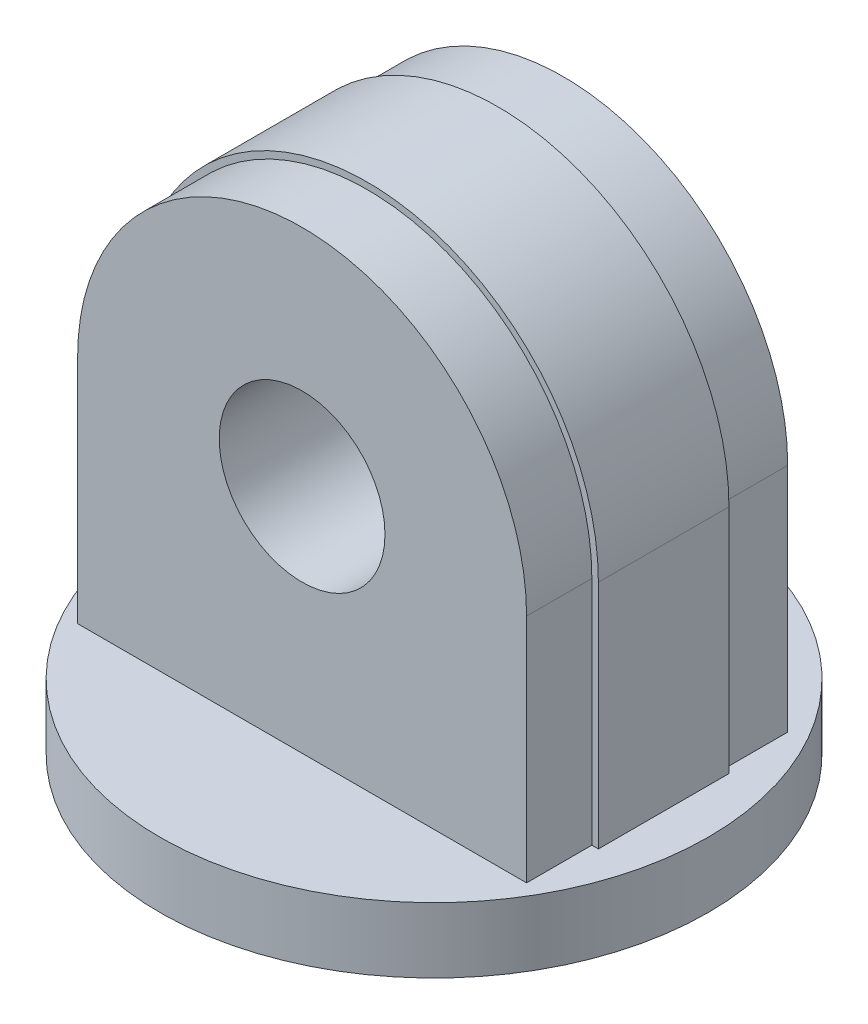
ISO-10303-21;
HEADER;
FILE_DESCRIPTION(('STEP AP214'),'2;1');
FILE_NAME('part.step','',(''),(''),'','','');
FILE_SCHEMA(('AUTOMOTIVE_DESIGN { 1 0 10303 214 1 1 1 1 }'));
ENDSEC;
DATA;
#1=APPLICATION_CONTEXT('core data for automotive mechanical design processes');
#2=APPLICATION_PROTOCOL_DEFINITION('international standard','automotive_design',2000,#1);
#3=PRODUCT_CONTEXT('',#1,'mechanical');
#4=PRODUCT('Part','Part','',(#3));
#5=PRODUCT_RELATED_PRODUCT_CATEGORY('part','',(#4));
#6=PRODUCT_DEFINITION_FORMATION('','',#4);
#7=PRODUCT_DEFINITION_CONTEXT('part definition',#1,'design');
#8=PRODUCT_DEFINITION('design','',#6,#7);
#9=PRODUCT_DEFINITION_SHAPE('','',#8);
#10=(LENGTH_UNIT() NAMED_UNIT(*) SI_UNIT(.MILLI.,.METRE.));
#11=(NAMED_UNIT(*) PLANE_ANGLE_UNIT() SI_UNIT($,.RADIAN.));
#12=(NAMED_UNIT(*) SI_UNIT($,.STERADIAN.) SOLID_ANGLE_UNIT());
#13=UNCERTAINTY_MEASURE_WITH_UNIT(LENGTH_MEASURE(1.E-05),#10,'distance_accuracy_value','');
#14=(GEOMETRIC_REPRESENTATION_CONTEXT(3) GLOBAL_UNCERTAINTY_ASSIGNED_CONTEXT((#13)) GLOBAL_UNIT_ASSIGNED_CONTEXT((#10,
#11,#12)) REPRESENTATION_CONTEXT('',''));
#15=CARTESIAN_POINT('',(0.,0.,0.));
#16=DIRECTION('',(0.,0.,1.));
#17=DIRECTION('',(1.,0.,0.));
#18=AXIS2_PLACEMENT_3D('',#15,#16,#17);
#19=CARTESIAN_POINT('',(8.9888749682031,-0.708464433330711,5.08));
#20=DIRECTION('',(0.,0.,-1.));
#21=DIRECTION('',(-1.,0.,0.));
#22=AXIS2_PLACEMENT_3D('',#19,#20,#21);
#23=CYLINDRICAL_SURFACE('',#22,8.98887496820316);
#24=CARTESIAN_POINT('',(8.9888749682031,-0.708464433330711,-2.54));
#25=DIRECTION('',(0.,0.,1.));
#26=DIRECTION('',(1.,0.,0.));
#27=AXIS2_PLACEMENT_3D('',#24,#25,#26);
#28=CIRCLE('',#27,8.98887496820316);
#29=CARTESIAN_POINT('',(17.9777499364063,-0.708464433330711,-2.54));
#30=VERTEX_POINT('',#29);
#31=CARTESIAN_POINT('',(0.,-0.708464433330711,-2.54));
#32=VERTEX_POINT('',#31);
#33=EDGE_CURVE('E190',#30,#32,#28,.T.);
#34=ORIENTED_EDGE('',*,*,#33,.T.);
#35=DIRECTION('',(0.,0.,-1.));
#36=VECTOR('',#35,1.);
#37=CARTESIAN_POINT('',(0.,-0.708464433330711,5.08));
#38=LINE('',#37,#36);
#39=CARTESIAN_POINT('',(0.,-0.708464433330711,2.54));
#40=VERTEX_POINT('',#39);
#41=EDGE_CURVE('E11',#40,#32,#38,.T.);
#42=ORIENTED_EDGE('',*,*,#41,.F.);
#43=CARTESIAN_POINT('',(8.9888749682031,-0.708464433330711,2.54));
#44=DIRECTION('',(0.,0.,1.));
#45=DIRECTION('',(1.,0.,0.));
#46=AXIS2_PLACEMENT_3D('',#43,#44,#45);
#47=CIRCLE('',#46,8.98887496820316);
#48=CARTESIAN_POINT('',(17.9777499364063,-0.708464433330711,2.54));
#49=VERTEX_POINT('',#48);
#50=EDGE_CURVE('E79',#49,#40,#47,.T.);
#51=ORIENTED_EDGE('',*,*,#50,.F.);
#52=DIRECTION('',(0.,0.,-1.));
#53=VECTOR('',#52,1.);
#54=CARTESIAN_POINT('',(17.9777499364063,-0.708464433330711,5.08));
#55=LINE('',#54,#53);
#56=EDGE_CURVE('E144',#49,#30,#55,.T.);
#57=ORIENTED_EDGE('',*,*,#56,.T.);
#58=EDGE_LOOP('',(#34,#42,#51,#57));
#59=FACE_BOUND('',#58,.T.);
#60=ADVANCED_FACE('F32',(#59),#23,.T.);
#61=CARTESIAN_POINT('',(0.,-9.69733940153393,5.08));
#62=DIRECTION('',(1.,0.,0.));
#63=DIRECTION('',(0.,0.,-1.));
#64=AXIS2_PLACEMENT_3D('',#61,#62,#63);
#65=PLANE('',#64);
#66=DIRECTION('',(0.,-1.,0.));
#67=VECTOR('',#66,1.);
#68=CARTESIAN_POINT('',(0.,-0.708464433330711,-2.54));
#69=LINE('',#68,#67);
#70=CARTESIAN_POINT('',(0.,-9.69733940153393,-2.54));
#71=VERTEX_POINT('',#70);
#72=EDGE_CURVE('E168',#32,#71,#69,.T.);
#73=ORIENTED_EDGE('',*,*,#72,.T.);
#74=DIRECTION('',(0.,0.,-1.));
#75=VECTOR('',#74,1.);
#76=CARTESIAN_POINT('',(0.,-9.69733940153393,5.08));
#77=LINE('',#76,#75);
#78=CARTESIAN_POINT('',(0.,-9.69733940153393,2.54));
#79=VERTEX_POINT('',#78);
#80=EDGE_CURVE('E41',#79,#71,#77,.T.);
#81=ORIENTED_EDGE('',*,*,#80,.F.);
#82=DIRECTION('',(0.,-1.,0.));
#83=VECTOR('',#82,1.);
#84=CARTESIAN_POINT('',(0.,-0.708464433330711,2.54));
#85=LINE('',#84,#83);
#86=EDGE_CURVE('E165',#40,#79,#85,.T.);
#87=ORIENTED_EDGE('',*,*,#86,.F.);
#88=ORIENTED_EDGE('',*,*,#41,.T.);
#89=EDGE_LOOP('',(#73,#81,#87,#88));
#90=FACE_BOUND('',#89,.T.);
#91=ADVANCED_FACE('F164',(#90),#65,.F.);
#92=CARTESIAN_POINT('',(17.9777499364063,-0.708464433330711,5.08));
#93=DIRECTION('',(-1.,0.,0.));
#94=DIRECTION('',(0.,-1.,0.));
#95=AXIS2_PLACEMENT_3D('',#92,#93,#94);
#96=PLANE('',#95);
#97=DIRECTION('',(0.,1.,0.));
#98=VECTOR('',#97,1.);
#99=CARTESIAN_POINT('',(17.9777499364063,-9.69733940153393,-2.54));
#100=LINE('',#99,#98);
#101=CARTESIAN_POINT('',(17.9777499364063,-9.69733940153393,-2.54));
#102=VERTEX_POINT('',#101);
#103=EDGE_CURVE('E233',#102,#30,#100,.T.);
#104=ORIENTED_EDGE('',*,*,#103,.T.);
#105=ORIENTED_EDGE('',*,*,#56,.F.);
#106=DIRECTION('',(0.,1.,0.));
#107=VECTOR('',#106,1.);
#108=CARTESIAN_POINT('',(17.9777499364063,-9.69733940153393,2.54));
#109=LINE('',#108,#107);
#110=CARTESIAN_POINT('',(17.9777499364063,-9.69733940153393,2.54));
#111=VERTEX_POINT('',#110);
#112=EDGE_CURVE('E49',#111,#49,#109,.T.);
#113=ORIENTED_EDGE('',*,*,#112,.F.);
#114=DIRECTION('',(0.,0.,-1.));
#115=VECTOR('',#114,1.);
#116=CARTESIAN_POINT('',(17.9777499364063,-9.69733940153393,5.08));
#117=LINE('',#116,#115);
#118=EDGE_CURVE('E109',#111,#102,#117,.T.);
#119=ORIENTED_EDGE('',*,*,#118,.T.);
#120=EDGE_LOOP('',(#104,#105,#113,#119));
#121=FACE_BOUND('',#120,.T.);
#122=ADVANCED_FACE('F218',(#121),#96,.F.);
#123=CARTESIAN_POINT('',(8.9888749682031,-0.708464433330711,-5.08));
#124=DIRECTION('',(0.,0.,-1.));
#125=DIRECTION('',(-1.,0.,0.));
#126=AXIS2_PLACEMENT_3D('',#123,#124,#125);
#127=PLANE('',#126);
#128=CARTESIAN_POINT('',(8.9888749682031,-0.708464433330711,-5.08));
#129=DIRECTION('',(0.,0.,-1.));
#130=DIRECTION('',(-1.,0.,0.));
#131=AXIS2_PLACEMENT_3D('',#128,#129,#130);
#132=CIRCLE('',#131,3.22500000000027);
#133=CARTESIAN_POINT('',(5.76387496820282,-0.708464433330711,-5.08));
#134=VERTEX_POINT('',#133);
#135=EDGE_CURVE('E35',#134,#134,#132,.T.);
#136=ORIENTED_EDGE('',*,*,#135,.F.);
#137=EDGE_LOOP('',(#136));
#138=FACE_BOUND('',#137,.T.);
#139=DIRECTION('',(1.,0.,0.));
#140=VECTOR('',#139,1.);
#141=CARTESIAN_POINT('',(17.9777499364063,-9.69733940153393,-5.08));
#142=LINE('',#141,#140);
#143=CARTESIAN_POINT('',(0.254,-9.69733940153393,-5.08));
#144=VERTEX_POINT('',#143);
#145=CARTESIAN_POINT('',(17.7237499364063,-9.69733940153393,-5.08));
#146=VERTEX_POINT('',#145);
#147=EDGE_CURVE('E138',#144,#146,#142,.T.);
#148=ORIENTED_EDGE('',*,*,#147,.F.);
#149=DIRECTION('',(0.,1.,0.));
#150=VECTOR('',#149,1.);
#151=CARTESIAN_POINT('',(0.254,-0.708464433330711,-5.08));
#152=LINE('',#151,#150);
#153=CARTESIAN_POINT('',(0.254,-0.708464433330711,-5.08));
#154=VERTEX_POINT('',#153);
#155=EDGE_CURVE('E187',#144,#154,#152,.T.);
#156=ORIENTED_EDGE('',*,*,#155,.T.);
#157=CARTESIAN_POINT('',(8.9888749682031,-0.708464433330711,-5.08));
#158=DIRECTION('',(0.,0.,-1.));
#159=DIRECTION('',(1.,0.,0.));
#160=AXIS2_PLACEMENT_3D('',#157,#158,#159);
#161=CIRCLE('',#160,8.73487496820313);
#162=CARTESIAN_POINT('',(17.7237499364062,-0.708464433330711,-5.08));
#163=VERTEX_POINT('',#162);
#164=EDGE_CURVE('E184',#154,#163,#161,.T.);
#165=ORIENTED_EDGE('',*,*,#164,.T.);
#166=DIRECTION('',(0.,-1.,0.));
#167=VECTOR('',#166,1.);
#168=CARTESIAN_POINT('',(17.7237499364063,-9.69733940153393,-5.08));
#169=LINE('',#168,#167);
#170=EDGE_CURVE('E181',#163,#146,#169,.T.);
#171=ORIENTED_EDGE('',*,*,#170,.T.);
#172=EDGE_LOOP('',(#148,#156,#165,#171));
#173=FACE_BOUND('',#172,.T.);
#174=ADVANCED_FACE('F209',(#138,#173),#127,.T.);
#175=CARTESIAN_POINT('',(8.9888749682031,-0.708464433330711,5.08));
#176=DIRECTION('',(0.,0.,-1.));
#177=DIRECTION('',(-1.,0.,0.));
#178=AXIS2_PLACEMENT_3D('',#175,#176,#177);
#179=PLANE('',#178);
#180=CARTESIAN_POINT('',(8.9888749682031,-0.708464433330711,5.08));
#181=DIRECTION('',(0.,0.,1.));
#182=DIRECTION('',(1.,0.,0.));
#183=AXIS2_PLACEMENT_3D('',#180,#181,#182);
#184=CIRCLE('',#183,3.22500000000027);
#185=CARTESIAN_POINT('',(12.2138749682034,-0.708464433330711,5.08));
#186=VERTEX_POINT('',#185);
#187=EDGE_CURVE('E101',#186,#186,#184,.T.);
#188=ORIENTED_EDGE('',*,*,#187,.F.);
#189=EDGE_LOOP('',(#188));
#190=FACE_BOUND('',#189,.T.);
#191=DIRECTION('',(1.,0.,0.));
#192=VECTOR('',#191,1.);
#193=CARTESIAN_POINT('',(17.9777499364063,-9.69733940153393,5.08));
#194=LINE('',#193,#192);
#195=CARTESIAN_POINT('',(0.254,-9.69733940153393,5.08));
#196=VERTEX_POINT('',#195);
#197=CARTESIAN_POINT('',(17.7237499364063,-9.69733940153393,5.08));
#198=VERTEX_POINT('',#197);
#199=EDGE_CURVE('E142',#196,#198,#194,.T.);
#200=ORIENTED_EDGE('',*,*,#199,.T.);
#201=DIRECTION('',(0.,-1.,0.));
#202=VECTOR('',#201,1.);
#203=CARTESIAN_POINT('',(17.7237499364063,-9.69733940153393,5.08));
#204=LINE('',#203,#202);
#205=CARTESIAN_POINT('',(17.7237499364062,-0.708464433330711,5.08));
#206=VERTEX_POINT('',#205);
#207=EDGE_CURVE('E99',#206,#198,#204,.T.);
#208=ORIENTED_EDGE('',*,*,#207,.F.);
#209=CARTESIAN_POINT('',(8.9888749682031,-0.708464433330711,5.08));
#210=DIRECTION('',(0.,0.,-1.));
#211=DIRECTION('',(1.,0.,0.));
#212=AXIS2_PLACEMENT_3D('',#209,#210,#211);
#213=CIRCLE('',#212,8.73487496820313);
#214=CARTESIAN_POINT('',(0.254,-0.708464433330711,5.08));
#215=VERTEX_POINT('',#214);
#216=EDGE_CURVE('E125',#215,#206,#213,.T.);
#217=ORIENTED_EDGE('',*,*,#216,.F.);
#218=DIRECTION('',(0.,1.,0.));
#219=VECTOR('',#218,1.);
#220=CARTESIAN_POINT('',(0.254,-0.708464433330711,5.08));
#221=LINE('',#220,#219);
#222=EDGE_CURVE('E122',#196,#215,#221,.T.);
#223=ORIENTED_EDGE('',*,*,#222,.F.);
#224=EDGE_LOOP('',(#200,#208,#217,#223));
#225=FACE_BOUND('',#224,.T.);
#226=ADVANCED_FACE('F207',(#190,#225),#179,.F.);
#227=CARTESIAN_POINT('',(9.0435857327458,-9.69733940153393,0.));
#228=DIRECTION('',(0.,-1.,0.));
#229=DIRECTION('',(1.,0.,0.));
#230=AXIS2_PLACEMENT_3D('',#227,#228,#229);
#231=PLANE('',#230);
#232=ORIENTED_EDGE('',*,*,#118,.F.);
#233=DIRECTION('',(1.,0.,0.));
#234=VECTOR('',#233,1.);
#235=CARTESIAN_POINT('',(17.7237499364063,-9.69733940153393,2.54));
#236=LINE('',#235,#234);
#237=CARTESIAN_POINT('',(17.7237499364063,-9.69733940153393,2.54));
#238=VERTEX_POINT('',#237);
#239=EDGE_CURVE('E104',#238,#111,#236,.T.);
#240=ORIENTED_EDGE('',*,*,#239,.F.);
#241=DIRECTION('',(0.,0.,1.));
#242=VECTOR('',#241,1.);
#243=CARTESIAN_POINT('',(17.7237499364063,-9.69733940153393,2.54));
#244=LINE('',#243,#242);
#245=EDGE_CURVE('E75',#238,#198,#244,.T.);
#246=ORIENTED_EDGE('',*,*,#245,.T.);
#247=ORIENTED_EDGE('',*,*,#199,.F.);
#248=DIRECTION('',(0.,0.,1.));
#249=VECTOR('',#248,1.);
#250=CARTESIAN_POINT('',(0.254,-9.69733940153393,2.54));
#251=LINE('',#250,#249);
#252=CARTESIAN_POINT('',(0.254,-9.69733940153393,2.54));
#253=VERTEX_POINT('',#252);
#254=EDGE_CURVE('E121',#253,#196,#251,.T.);
#255=ORIENTED_EDGE('',*,*,#254,.F.);
#256=DIRECTION('',(1.,0.,0.));
#257=VECTOR('',#256,1.);
#258=CARTESIAN_POINT('',(0.254,-9.69733940153393,2.54));
#259=LINE('',#258,#257);
#260=EDGE_CURVE('E160',#79,#253,#259,.T.);
#261=ORIENTED_EDGE('',*,*,#260,.F.);
#262=ORIENTED_EDGE('',*,*,#80,.T.);
#263=DIRECTION('',(1.,0.,0.));
#264=VECTOR('',#263,1.);
#265=CARTESIAN_POINT('',(0.254,-9.69733940153393,-2.54));
#266=LINE('',#265,#264);
#267=CARTESIAN_POINT('',(0.254,-9.69733940153393,-2.54));
#268=VERTEX_POINT('',#267);
#269=EDGE_CURVE('E157',#71,#268,#266,.T.);
#270=ORIENTED_EDGE('',*,*,#269,.T.);
#271=DIRECTION('',(0.,0.,-1.));
#272=VECTOR('',#271,1.);
#273=CARTESIAN_POINT('',(0.254,-9.69733940153393,-2.54));
#274=LINE('',#273,#272);
#275=EDGE_CURVE('E126',#268,#144,#274,.T.);
#276=ORIENTED_EDGE('',*,*,#275,.T.);
#277=ORIENTED_EDGE('',*,*,#147,.T.);
#278=DIRECTION('',(0.,0.,-1.));
#279=VECTOR('',#278,1.);
#280=CARTESIAN_POINT('',(17.7237499364063,-9.69733940153393,-2.54));
#281=LINE('',#280,#279);
#282=CARTESIAN_POINT('',(17.7237499364063,-9.69733940153393,-2.54));
#283=VERTEX_POINT('',#282);
#284=EDGE_CURVE('E172',#283,#146,#281,.T.);
#285=ORIENTED_EDGE('',*,*,#284,.F.);
#286=DIRECTION('',(1.,0.,0.));
#287=VECTOR('',#286,1.);
#288=CARTESIAN_POINT('',(17.7237499364063,-9.69733940153393,-2.54));
#289=LINE('',#288,#287);
#290=EDGE_CURVE('E235',#283,#102,#289,.T.);
#291=ORIENTED_EDGE('',*,*,#290,.T.);
#292=EDGE_LOOP('',(#232,#240,#246,#247,#255,#261,#262,#270,#276,#277,#285,#291));
#293=FACE_BOUND('',#292,.T.);
#294=CARTESIAN_POINT('',(9.0435857327458,-9.69733940153393,0.));
#295=DIRECTION('',(0.,-1.,0.));
#296=DIRECTION('',(1.,0.,0.));
#297=AXIS2_PLACEMENT_3D('',#294,#295,#296);
#298=CIRCLE('',#297,10.6746275824842);
#299=CARTESIAN_POINT('',(19.71821331523,-9.69733940153393,0.));
#300=VERTEX_POINT('',#299);
#301=EDGE_CURVE('E139',#300,#300,#298,.T.);
#302=ORIENTED_EDGE('',*,*,#301,.F.);
#303=EDGE_LOOP('',(#302));
#304=FACE_BOUND('',#303,.T.);
#305=ADVANCED_FACE('F105',(#293,#304),#231,.F.);
#306=CARTESIAN_POINT('',(9.0435857327458,-12.2373394015339,0.));
#307=DIRECTION('',(0.,1.,0.));
#308=DIRECTION('',(-1.,0.,0.));
#309=AXIS2_PLACEMENT_3D('',#306,#307,#308);
#310=CYLINDRICAL_SURFACE('',#309,10.6746275824842);
#311=CARTESIAN_POINT('',(9.0435857327458,-12.2373394015339,0.));
#312=DIRECTION('',(0.,-1.,0.));
#313=DIRECTION('',(1.,0.,0.));
#314=AXIS2_PLACEMENT_3D('',#311,#312,#313);
#315=CIRCLE('',#314,10.6746275824842);
#316=CARTESIAN_POINT('',(19.71821331523,-12.2373394015339,0.));
#317=VERTEX_POINT('',#316);
#318=EDGE_CURVE('E135',#317,#317,#315,.T.);
#319=ORIENTED_EDGE('',*,*,#318,.F.);
#320=EDGE_LOOP('',(#319));
#321=FACE_BOUND('',#320,.T.);
#322=ORIENTED_EDGE('',*,*,#301,.T.);
#323=EDGE_LOOP('',(#322));
#324=FACE_BOUND('',#323,.T.);
#325=ADVANCED_FACE('F216',(#321,#324),#310,.T.);
#326=CARTESIAN_POINT('',(9.0435857327458,-12.2373394015339,0.));
#327=DIRECTION('',(0.,-1.,0.));
#328=DIRECTION('',(1.,0.,0.));
#329=AXIS2_PLACEMENT_3D('',#326,#327,#328);
#330=PLANE('',#329);
#331=ORIENTED_EDGE('',*,*,#318,.T.);
#332=EDGE_LOOP('',(#331));
#333=FACE_BOUND('',#332,.T.);
#334=ADVANCED_FACE('F347',(#333),#330,.T.);
#335=CARTESIAN_POINT('',(8.9888749682031,-0.708464433330711,-10.6746275824842));
#336=DIRECTION('',(0.,0.,1.));
#337=DIRECTION('',(1.,0.,0.));
#338=AXIS2_PLACEMENT_3D('',#335,#336,#337);
#339=CYLINDRICAL_SURFACE('',#338,3.22500000000027);
#340=ORIENTED_EDGE('',*,*,#135,.T.);
#341=EDGE_LOOP('',(#340));
#342=FACE_BOUND('',#341,.T.);
#343=ORIENTED_EDGE('',*,*,#187,.T.);
#344=EDGE_LOOP('',(#343));
#345=FACE_BOUND('',#344,.T.);
#346=ADVANCED_FACE('F340',(#342,#345),#339,.F.);
#347=CARTESIAN_POINT('',(17.7237499364063,-9.69733940153393,2.54));
#348=DIRECTION('',(-1.,0.,0.));
#349=DIRECTION('',(0.,-1.,0.));
#350=AXIS2_PLACEMENT_3D('',#347,#348,#349);
#351=PLANE('',#350);
#352=ORIENTED_EDGE('',*,*,#207,.T.);
#353=ORIENTED_EDGE('',*,*,#245,.F.);
#354=DIRECTION('',(0.,-1.,0.));
#355=VECTOR('',#354,1.);
#356=CARTESIAN_POINT('',(17.7237499364063,-9.69733940153393,2.54));
#357=LINE('',#356,#355);
#358=CARTESIAN_POINT('',(17.7237499364062,-0.708464433330711,2.54));
#359=VERTEX_POINT('',#358);
#360=EDGE_CURVE('E96',#359,#238,#357,.T.);
#361=ORIENTED_EDGE('',*,*,#360,.F.);
#362=DIRECTION('',(0.,0.,1.));
#363=VECTOR('',#362,1.);
#364=CARTESIAN_POINT('',(17.7237499364062,-0.708464433330711,2.54));
#365=LINE('',#364,#363);
#366=EDGE_CURVE('E67',#359,#206,#365,.T.);
#367=ORIENTED_EDGE('',*,*,#366,.T.);
#368=EDGE_LOOP('',(#352,#353,#361,#367));
#369=FACE_BOUND('',#368,.T.);
#370=ADVANCED_FACE('F94',(#369),#351,.F.);
#371=CARTESIAN_POINT('',(8.9888749682031,-0.708464433330711,2.54));
#372=DIRECTION('',(0.,0.,1.));
#373=DIRECTION('',(1.,0.,0.));
#374=AXIS2_PLACEMENT_3D('',#371,#372,#373);
#375=CYLINDRICAL_SURFACE('',#374,8.73487496820313);
#376=ORIENTED_EDGE('',*,*,#216,.T.);
#377=ORIENTED_EDGE('',*,*,#366,.F.);
#378=CARTESIAN_POINT('',(8.9888749682031,-0.708464433330711,2.54));
#379=DIRECTION('',(0.,0.,-1.));
#380=DIRECTION('',(1.,0.,0.));
#381=AXIS2_PLACEMENT_3D('',#378,#379,#380);
#382=CIRCLE('',#381,8.73487496820313);
#383=CARTESIAN_POINT('',(0.254,-0.708464433330711,2.54));
#384=VERTEX_POINT('',#383);
#385=EDGE_CURVE('E114',#384,#359,#382,.T.);
#386=ORIENTED_EDGE('',*,*,#385,.F.);
#387=DIRECTION('',(0.,0.,1.));
#388=VECTOR('',#387,1.);
#389=CARTESIAN_POINT('',(0.254,-0.708464433330711,2.54));
#390=LINE('',#389,#388);
#391=EDGE_CURVE('E130',#384,#215,#390,.T.);
#392=ORIENTED_EDGE('',*,*,#391,.T.);
#393=EDGE_LOOP('',(#376,#377,#386,#392));
#394=FACE_BOUND('',#393,.T.);
#395=ADVANCED_FACE('F205',(#394),#375,.T.);
#396=CARTESIAN_POINT('',(0.254,-0.708464433330711,2.54));
#397=DIRECTION('',(1.,0.,0.));
#398=DIRECTION('',(0.,0.,-1.));
#399=AXIS2_PLACEMENT_3D('',#396,#397,#398);
#400=PLANE('',#399);
#401=ORIENTED_EDGE('',*,*,#222,.T.);
#402=ORIENTED_EDGE('',*,*,#391,.F.);
#403=DIRECTION('',(0.,1.,0.));
#404=VECTOR('',#403,1.);
#405=CARTESIAN_POINT('',(0.254,-0.708464433330711,2.54));
#406=LINE('',#405,#404);
#407=EDGE_CURVE('E116',#253,#384,#406,.T.);
#408=ORIENTED_EDGE('',*,*,#407,.F.);
#409=ORIENTED_EDGE('',*,*,#254,.T.);
#410=EDGE_LOOP('',(#401,#402,#408,#409));
#411=FACE_BOUND('',#410,.T.);
#412=ADVANCED_FACE('F201',(#411),#400,.F.);
#413=CARTESIAN_POINT('',(8.9888749682031,-0.708464433330711,2.54));
#414=DIRECTION('',(0.,0.,1.));
#415=DIRECTION('',(1.,0.,0.));
#416=AXIS2_PLACEMENT_3D('',#413,#414,#415);
#417=PLANE('',#416);
#418=ORIENTED_EDGE('',*,*,#50,.T.);
#419=ORIENTED_EDGE('',*,*,#86,.T.);
#420=ORIENTED_EDGE('',*,*,#260,.T.);
#421=ORIENTED_EDGE('',*,*,#407,.T.);
#422=ORIENTED_EDGE('',*,*,#385,.T.);
#423=ORIENTED_EDGE('',*,*,#360,.T.);
#424=ORIENTED_EDGE('',*,*,#239,.T.);
#425=ORIENTED_EDGE('',*,*,#112,.T.);
#426=EDGE_LOOP('',(#418,#419,#420,#421,#422,#423,#424,#425));
#427=FACE_BOUND('',#426,.T.);
#428=ADVANCED_FACE('F111',(#427),#417,.T.);
#429=CARTESIAN_POINT('',(0.254,-0.708464433330711,-2.54));
#430=DIRECTION('',(-1.,0.,0.));
#431=DIRECTION('',(0.,0.,1.));
#432=AXIS2_PLACEMENT_3D('',#429,#430,#431);
#433=PLANE('',#432);
#434=ORIENTED_EDGE('',*,*,#155,.F.);
#435=ORIENTED_EDGE('',*,*,#275,.F.);
#436=DIRECTION('',(0.,1.,0.));
#437=VECTOR('',#436,1.);
#438=CARTESIAN_POINT('',(0.254,-0.708464433330711,-2.54));
#439=LINE('',#438,#437);
#440=CARTESIAN_POINT('',(0.254,-0.708464433330711,-2.54));
#441=VERTEX_POINT('',#440);
#442=EDGE_CURVE('E177',#268,#441,#439,.T.);
#443=ORIENTED_EDGE('',*,*,#442,.T.);
#444=DIRECTION('',(0.,0.,-1.));
#445=VECTOR('',#444,1.);
#446=CARTESIAN_POINT('',(0.254,-0.708464433330711,-2.54));
#447=LINE('',#446,#445);
#448=EDGE_CURVE('E192',#441,#154,#447,.T.);
#449=ORIENTED_EDGE('',*,*,#448,.T.);
#450=EDGE_LOOP('',(#434,#435,#443,#449));
#451=FACE_BOUND('',#450,.T.);
#452=ADVANCED_FACE('F250',(#451),#433,.T.);
#453=CARTESIAN_POINT('',(8.9888749682031,-0.708464433330711,-2.54));
#454=DIRECTION('',(0.,0.,-1.));
#455=DIRECTION('',(-1.,0.,0.));
#456=AXIS2_PLACEMENT_3D('',#453,#454,#455);
#457=CYLINDRICAL_SURFACE('',#456,8.73487496820313);
#458=ORIENTED_EDGE('',*,*,#164,.F.);
#459=ORIENTED_EDGE('',*,*,#448,.F.);
#460=CARTESIAN_POINT('',(8.9888749682031,-0.708464433330711,-2.54));
#461=DIRECTION('',(0.,0.,-1.));
#462=DIRECTION('',(1.,0.,0.));
#463=AXIS2_PLACEMENT_3D('',#460,#461,#462);
#464=CIRCLE('',#463,8.73487496820313);
#465=CARTESIAN_POINT('',(17.7237499364062,-0.708464433330711,-2.54));
#466=VERTEX_POINT('',#465);
#467=EDGE_CURVE('E242',#441,#466,#464,.T.);
#468=ORIENTED_EDGE('',*,*,#467,.T.);
#469=DIRECTION('',(0.,0.,-1.));
#470=VECTOR('',#469,1.);
#471=CARTESIAN_POINT('',(17.7237499364062,-0.708464433330711,-2.54));
#472=LINE('',#471,#470);
#473=EDGE_CURVE('E175',#466,#163,#472,.T.);
#474=ORIENTED_EDGE('',*,*,#473,.T.);
#475=EDGE_LOOP('',(#458,#459,#468,#474));
#476=FACE_BOUND('',#475,.T.);
#477=ADVANCED_FACE('F257',(#476),#457,.T.);
#478=CARTESIAN_POINT('',(17.7237499364063,-9.69733940153393,-2.54));
#479=DIRECTION('',(1.,0.,0.));
#480=DIRECTION('',(0.,1.,0.));
#481=AXIS2_PLACEMENT_3D('',#478,#479,#480);
#482=PLANE('',#481);
#483=ORIENTED_EDGE('',*,*,#170,.F.);
#484=ORIENTED_EDGE('',*,*,#473,.F.);
#485=DIRECTION('',(0.,-1.,0.));
#486=VECTOR('',#485,1.);
#487=CARTESIAN_POINT('',(17.7237499364063,-9.69733940153393,-2.54));
#488=LINE('',#487,#486);
#489=EDGE_CURVE('E239',#466,#283,#488,.T.);
#490=ORIENTED_EDGE('',*,*,#489,.T.);
#491=ORIENTED_EDGE('',*,*,#284,.T.);
#492=EDGE_LOOP('',(#483,#484,#490,#491));
#493=FACE_BOUND('',#492,.T.);
#494=ADVANCED_FACE('F267',(#493),#482,.T.);
#495=CARTESIAN_POINT('',(8.9888749682031,-0.708464433330711,-2.54));
#496=DIRECTION('',(0.,0.,-1.));
#497=DIRECTION('',(1.,0.,0.));
#498=AXIS2_PLACEMENT_3D('',#495,#496,#497);
#499=PLANE('',#498);
#500=ORIENTED_EDGE('',*,*,#33,.F.);
#501=ORIENTED_EDGE('',*,*,#103,.F.);
#502=ORIENTED_EDGE('',*,*,#290,.F.);
#503=ORIENTED_EDGE('',*,*,#489,.F.);
#504=ORIENTED_EDGE('',*,*,#467,.F.);
#505=ORIENTED_EDGE('',*,*,#442,.F.);
#506=ORIENTED_EDGE('',*,*,#269,.F.);
#507=ORIENTED_EDGE('',*,*,#72,.F.);
#508=EDGE_LOOP('',(#500,#501,#502,#503,#504,#505,#506,#507));
#509=FACE_BOUND('',#508,.T.);
#510=ADVANCED_FACE('F260',(#509),#499,.T.);
#511=CLOSED_SHELL('',(#60,#91,#122,#174,#226,#305,#325,#334,#346,#370,#395,#412,#428,#452,#477,
#494,#510));
#512=MANIFOLD_SOLID_BREP('B2',#511);
#513=ADVANCED_BREP_SHAPE_REPRESENTATION('',(#18,#512),#14);
#514=SHAPE_DEFINITION_REPRESENTATION(#9,#513);
ENDSEC;
END-ISO-10303-21;
